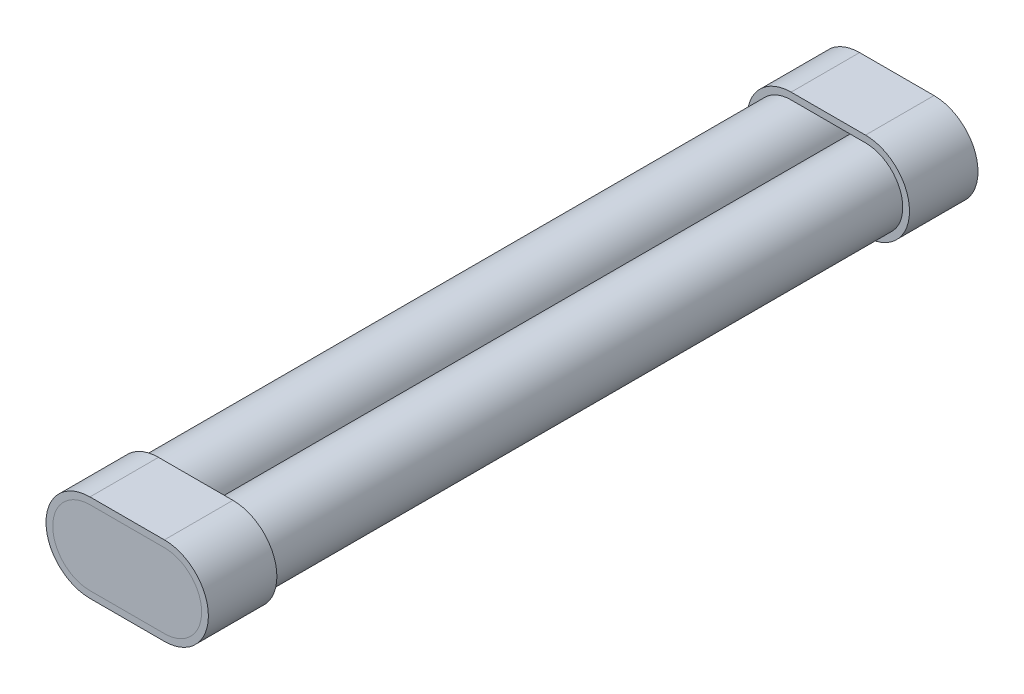
ISO-10303-21;
HEADER;
FILE_DESCRIPTION(('STEP AP214'),'2;1');
FILE_NAME('part.step','',(''),(''),'','','');
FILE_SCHEMA(('AUTOMOTIVE_DESIGN { 1 0 10303 214 1 1 1 1 }'));
ENDSEC;
DATA;
#1=APPLICATION_CONTEXT('core data for automotive mechanical design processes');
#2=APPLICATION_PROTOCOL_DEFINITION('international standard','automotive_design',2000,#1);
#3=PRODUCT_CONTEXT('',#1,'mechanical');
#4=PRODUCT('Part','Part','',(#3));
#5=PRODUCT_RELATED_PRODUCT_CATEGORY('part','',(#4));
#6=PRODUCT_DEFINITION_FORMATION('','',#4);
#7=PRODUCT_DEFINITION_CONTEXT('part definition',#1,'design');
#8=PRODUCT_DEFINITION('design','',#6,#7);
#9=PRODUCT_DEFINITION_SHAPE('','',#8);
#10=(LENGTH_UNIT() NAMED_UNIT(*) SI_UNIT(.MILLI.,.METRE.));
#11=(NAMED_UNIT(*) PLANE_ANGLE_UNIT() SI_UNIT($,.RADIAN.));
#12=(NAMED_UNIT(*) SI_UNIT($,.STERADIAN.) SOLID_ANGLE_UNIT());
#13=UNCERTAINTY_MEASURE_WITH_UNIT(LENGTH_MEASURE(1.E-05),#10,'distance_accuracy_value','');
#14=(GEOMETRIC_REPRESENTATION_CONTEXT(3) GLOBAL_UNCERTAINTY_ASSIGNED_CONTEXT((#13)) GLOBAL_UNIT_ASSIGNED_CONTEXT((#10,
#11,#12)) REPRESENTATION_CONTEXT('',''));
#15=CARTESIAN_POINT('',(0.,0.,0.));
#16=DIRECTION('',(0.,0.,1.));
#17=DIRECTION('',(1.,0.,0.));
#18=AXIS2_PLACEMENT_3D('',#15,#16,#17);
#19=CARTESIAN_POINT('',(0.,-11.,-225.5));
#20=DIRECTION('',(0.,1.,0.));
#21=DIRECTION('',(-1.,0.,0.));
#22=AXIS2_PLACEMENT_3D('',#19,#20,#21);
#23=PLANE('',#22);
#24=DIRECTION('',(-1.,0.,0.));
#25=VECTOR('',#24,1.);
#26=CARTESIAN_POINT('',(0.,-11.,-223.5));
#27=LINE('',#26,#25);
#28=CARTESIAN_POINT('',(11.,-11.,-223.5));
#29=VERTEX_POINT('',#28);
#30=CARTESIAN_POINT('',(-11.,-11.,-223.5));
#31=VERTEX_POINT('',#30);
#32=EDGE_CURVE('E126',#29,#31,#27,.T.);
#33=ORIENTED_EDGE('',*,*,#32,.T.);
#34=DIRECTION('',(0.,0.,1.));
#35=VECTOR('',#34,1.);
#36=CARTESIAN_POINT('',(-11.,-11.,-225.5));
#37=LINE('',#36,#35);
#38=CARTESIAN_POINT('',(-11.,-11.,-225.5));
#39=VERTEX_POINT('',#38);
#40=EDGE_CURVE('E13',#39,#31,#37,.T.);
#41=ORIENTED_EDGE('',*,*,#40,.F.);
#42=DIRECTION('',(-1.,0.,0.));
#43=VECTOR('',#42,1.);
#44=CARTESIAN_POINT('',(0.,-11.,-225.5));
#45=LINE('',#44,#43);
#46=CARTESIAN_POINT('',(11.,-11.,-225.5));
#47=VERTEX_POINT('',#46);
#48=EDGE_CURVE('E111',#47,#39,#45,.T.);
#49=ORIENTED_EDGE('',*,*,#48,.F.);
#50=DIRECTION('',(0.,0.,1.));
#51=VECTOR('',#50,1.);
#52=CARTESIAN_POINT('',(11.,-11.,-225.5));
#53=LINE('',#52,#51);
#54=EDGE_CURVE('E122',#47,#29,#53,.T.);
#55=ORIENTED_EDGE('',*,*,#54,.T.);
#56=EDGE_LOOP('',(#33,#41,#49,#55));
#57=FACE_BOUND('',#56,.T.);
#58=ADVANCED_FACE('F64',(#57),#23,.F.);
#59=CARTESIAN_POINT('',(-11.,0.,-225.5));
#60=DIRECTION('',(0.,0.,1.));
#61=DIRECTION('',(1.,0.,0.));
#62=AXIS2_PLACEMENT_3D('',#59,#60,#61);
#63=CYLINDRICAL_SURFACE('',#62,11.);
#64=CARTESIAN_POINT('',(-11.,0.,-223.5));
#65=DIRECTION('',(0.,0.,-1.));
#66=DIRECTION('',(-1.,0.,0.));
#67=AXIS2_PLACEMENT_3D('',#64,#65,#66);
#68=CIRCLE('',#67,11.);
#69=CARTESIAN_POINT('',(-11.,11.,-223.5));
#70=VERTEX_POINT('',#69);
#71=EDGE_CURVE('E116',#31,#70,#68,.T.);
#72=ORIENTED_EDGE('',*,*,#71,.T.);
#73=DIRECTION('',(0.,0.,1.));
#74=VECTOR('',#73,1.);
#75=CARTESIAN_POINT('',(-11.,11.,-225.5));
#76=LINE('',#75,#74);
#77=CARTESIAN_POINT('',(-11.,11.,-225.5));
#78=VERTEX_POINT('',#77);
#79=EDGE_CURVE('E72',#78,#70,#76,.T.);
#80=ORIENTED_EDGE('',*,*,#79,.F.);
#81=CARTESIAN_POINT('',(-11.,0.,-225.5));
#82=DIRECTION('',(0.,0.,-1.));
#83=DIRECTION('',(-1.,0.,0.));
#84=AXIS2_PLACEMENT_3D('',#81,#82,#83);
#85=CIRCLE('',#84,11.);
#86=EDGE_CURVE('E106',#39,#78,#85,.T.);
#87=ORIENTED_EDGE('',*,*,#86,.F.);
#88=ORIENTED_EDGE('',*,*,#40,.T.);
#89=EDGE_LOOP('',(#72,#80,#87,#88));
#90=FACE_BOUND('',#89,.T.);
#91=ADVANCED_FACE('F115',(#90),#63,.T.);
#92=CARTESIAN_POINT('',(0.,11.,-225.5));
#93=DIRECTION('',(0.,1.,0.));
#94=DIRECTION('',(-1.,0.,0.));
#95=AXIS2_PLACEMENT_3D('',#92,#93,#94);
#96=PLANE('',#95);
#97=DIRECTION('',(-1.,0.,0.));
#98=VECTOR('',#97,1.);
#99=CARTESIAN_POINT('',(0.,11.,-223.5));
#100=LINE('',#99,#98);
#101=CARTESIAN_POINT('',(11.,11.,-223.5));
#102=VERTEX_POINT('',#101);
#103=EDGE_CURVE('E130',#102,#70,#100,.T.);
#104=ORIENTED_EDGE('',*,*,#103,.F.);
#105=DIRECTION('',(0.,0.,1.));
#106=VECTOR('',#105,1.);
#107=CARTESIAN_POINT('',(11.,11.,-225.5));
#108=LINE('',#107,#106);
#109=CARTESIAN_POINT('',(11.,11.,-225.5));
#110=VERTEX_POINT('',#109);
#111=EDGE_CURVE('E96',#110,#102,#108,.T.);
#112=ORIENTED_EDGE('',*,*,#111,.F.);
#113=DIRECTION('',(-1.,0.,0.));
#114=VECTOR('',#113,1.);
#115=CARTESIAN_POINT('',(0.,11.,-225.5));
#116=LINE('',#115,#114);
#117=EDGE_CURVE('E109',#110,#78,#116,.T.);
#118=ORIENTED_EDGE('',*,*,#117,.T.);
#119=ORIENTED_EDGE('',*,*,#79,.T.);
#120=EDGE_LOOP('',(#104,#112,#118,#119));
#121=FACE_BOUND('',#120,.T.);
#122=ADVANCED_FACE('F120',(#121),#96,.T.);
#123=CARTESIAN_POINT('',(11.,0.,-225.5));
#124=DIRECTION('',(0.,0.,1.));
#125=DIRECTION('',(1.,0.,0.));
#126=AXIS2_PLACEMENT_3D('',#123,#124,#125);
#127=CYLINDRICAL_SURFACE('',#126,11.);
#128=CARTESIAN_POINT('',(11.,0.,-223.5));
#129=DIRECTION('',(0.,0.,-1.));
#130=DIRECTION('',(-1.,0.,0.));
#131=AXIS2_PLACEMENT_3D('',#128,#129,#130);
#132=CIRCLE('',#131,11.);
#133=EDGE_CURVE('E99',#102,#29,#132,.T.);
#134=ORIENTED_EDGE('',*,*,#133,.T.);
#135=ORIENTED_EDGE('',*,*,#54,.F.);
#136=CARTESIAN_POINT('',(11.,0.,-225.5));
#137=DIRECTION('',(0.,0.,-1.));
#138=DIRECTION('',(-1.,0.,0.));
#139=AXIS2_PLACEMENT_3D('',#136,#137,#138);
#140=CIRCLE('',#139,11.);
#141=EDGE_CURVE('E80',#110,#47,#140,.T.);
#142=ORIENTED_EDGE('',*,*,#141,.F.);
#143=ORIENTED_EDGE('',*,*,#111,.T.);
#144=EDGE_LOOP('',(#134,#135,#142,#143));
#145=FACE_BOUND('',#144,.T.);
#146=ADVANCED_FACE('F143',(#145),#127,.T.);
#147=CARTESIAN_POINT('',(0.,0.,-225.5));
#148=DIRECTION('',(0.,0.,-1.));
#149=DIRECTION('',(-1.,0.,0.));
#150=AXIS2_PLACEMENT_3D('',#147,#148,#149);
#151=PLANE('',#150);
#152=ORIENTED_EDGE('',*,*,#48,.T.);
#153=ORIENTED_EDGE('',*,*,#86,.T.);
#154=ORIENTED_EDGE('',*,*,#117,.F.);
#155=ORIENTED_EDGE('',*,*,#141,.T.);
#156=EDGE_LOOP('',(#152,#153,#154,#155));
#157=FACE_BOUND('',#156,.T.);
#158=ADVANCED_FACE('F107',(#157),#151,.T.);
#159=CARTESIAN_POINT('',(0.,0.,-223.5));
#160=DIRECTION('',(0.,0.,-1.));
#161=DIRECTION('',(-1.,0.,0.));
#162=AXIS2_PLACEMENT_3D('',#159,#160,#161);
#163=PLANE('',#162);
#164=ORIENTED_EDGE('',*,*,#32,.F.);
#165=ORIENTED_EDGE('',*,*,#133,.F.);
#166=ORIENTED_EDGE('',*,*,#103,.T.);
#167=ORIENTED_EDGE('',*,*,#71,.F.);
#168=EDGE_LOOP('',(#164,#165,#166,#167));
#169=FACE_BOUND('',#168,.T.);
#170=ADVANCED_FACE('F137',(#169),#163,.F.);
#171=CLOSED_SHELL('',(#58,#91,#122,#146,#158,#170));
#172=MANIFOLD_SOLID_BREP('B2',#171);
#173=CARTESIAN_POINT('',(0.,-13.,-225.5));
#174=DIRECTION('',(0.,1.,0.));
#175=DIRECTION('',(0.,0.,1.));
#176=AXIS2_PLACEMENT_3D('',#173,#174,#175);
#177=PLANE('',#176);
#178=DIRECTION('',(0.,0.,1.));
#179=VECTOR('',#178,1.);
#180=CARTESIAN_POINT('',(11.,-13.,-225.5));
#181=LINE('',#180,#179);
#182=CARTESIAN_POINT('',(11.,-13.,-225.5));
#183=VERTEX_POINT('',#182);
#184=CARTESIAN_POINT('',(11.,-13.,-205.25));
#185=VERTEX_POINT('',#184);
#186=EDGE_CURVE('E320',#183,#185,#181,.T.);
#187=ORIENTED_EDGE('',*,*,#186,.T.);
#188=DIRECTION('',(-1.,0.,0.));
#189=VECTOR('',#188,1.);
#190=CARTESIAN_POINT('',(0.,-13.,-205.25));
#191=LINE('',#190,#189);
#192=CARTESIAN_POINT('',(-11.,-13.,-205.25));
#193=VERTEX_POINT('',#192);
#194=EDGE_CURVE('E339',#185,#193,#191,.T.);
#195=ORIENTED_EDGE('',*,*,#194,.T.);
#196=DIRECTION('',(0.,0.,1.));
#197=VECTOR('',#196,1.);
#198=CARTESIAN_POINT('',(-11.,-13.,-225.5));
#199=LINE('',#198,#197);
#200=CARTESIAN_POINT('',(-11.,-13.,-225.5));
#201=VERTEX_POINT('',#200);
#202=EDGE_CURVE('E62',#201,#193,#199,.T.);
#203=ORIENTED_EDGE('',*,*,#202,.F.);
#204=DIRECTION('',(-1.,0.,0.));
#205=VECTOR('',#204,1.);
#206=CARTESIAN_POINT('',(0.,-13.,-225.5));
#207=LINE('',#206,#205);
#208=EDGE_CURVE('E360',#183,#201,#207,.T.);
#209=ORIENTED_EDGE('',*,*,#208,.F.);
#210=EDGE_LOOP('',(#187,#195,#203,#209));
#211=FACE_BOUND('',#210,.T.);
#212=ADVANCED_FACE('F243',(#211),#177,.F.);
#213=CARTESIAN_POINT('',(-11.,0.,-225.5));
#214=DIRECTION('',(0.,0.,1.));
#215=DIRECTION('',(1.,0.,0.));
#216=AXIS2_PLACEMENT_3D('',#213,#214,#215);
#217=CYLINDRICAL_SURFACE('',#216,13.);
#218=ORIENTED_EDGE('',*,*,#202,.T.);
#219=CARTESIAN_POINT('',(-11.,0.,-205.25));
#220=DIRECTION('',(0.,0.,-1.));
#221=DIRECTION('',(-1.,0.,0.));
#222=AXIS2_PLACEMENT_3D('',#219,#220,#221);
#223=CIRCLE('',#222,13.);
#224=CARTESIAN_POINT('',(-11.,13.,-205.25));
#225=VERTEX_POINT('',#224);
#226=EDGE_CURVE('E342',#193,#225,#223,.T.);
#227=ORIENTED_EDGE('',*,*,#226,.T.);
#228=DIRECTION('',(0.,0.,1.));
#229=VECTOR('',#228,1.);
#230=CARTESIAN_POINT('',(-11.,13.,-225.5));
#231=LINE('',#230,#229);
#232=CARTESIAN_POINT('',(-11.,13.,-225.5));
#233=VERTEX_POINT('',#232);
#234=EDGE_CURVE('E252',#233,#225,#231,.T.);
#235=ORIENTED_EDGE('',*,*,#234,.F.);
#236=CARTESIAN_POINT('',(-11.,0.,-225.5));
#237=DIRECTION('',(0.,0.,-1.));
#238=DIRECTION('',(-1.,0.,0.));
#239=AXIS2_PLACEMENT_3D('',#236,#237,#238);
#240=CIRCLE('',#239,13.);
#241=EDGE_CURVE('E362',#201,#233,#240,.T.);
#242=ORIENTED_EDGE('',*,*,#241,.F.);
#243=EDGE_LOOP('',(#218,#227,#235,#242));
#244=FACE_BOUND('',#243,.T.);
#245=ADVANCED_FACE('F392',(#244),#217,.T.);
#246=CARTESIAN_POINT('',(0.,13.,-225.5));
#247=DIRECTION('',(0.,1.,0.));
#248=DIRECTION('',(0.,0.,1.));
#249=AXIS2_PLACEMENT_3D('',#246,#247,#248);
#250=PLANE('',#249);
#251=ORIENTED_EDGE('',*,*,#234,.T.);
#252=DIRECTION('',(-1.,0.,0.));
#253=VECTOR('',#252,1.);
#254=CARTESIAN_POINT('',(0.,13.,-205.25));
#255=LINE('',#254,#253);
#256=CARTESIAN_POINT('',(11.,13.,-205.25));
#257=VERTEX_POINT('',#256);
#258=EDGE_CURVE('E345',#257,#225,#255,.T.);
#259=ORIENTED_EDGE('',*,*,#258,.F.);
#260=DIRECTION('',(0.,0.,1.));
#261=VECTOR('',#260,1.);
#262=CARTESIAN_POINT('',(11.,13.,-225.5));
#263=LINE('',#262,#261);
#264=CARTESIAN_POINT('',(11.,13.,-225.5));
#265=VERTEX_POINT('',#264);
#266=EDGE_CURVE('E268',#265,#257,#263,.T.);
#267=ORIENTED_EDGE('',*,*,#266,.F.);
#268=DIRECTION('',(-1.,0.,0.));
#269=VECTOR('',#268,1.);
#270=CARTESIAN_POINT('',(0.,13.,-225.5));
#271=LINE('',#270,#269);
#272=EDGE_CURVE('E364',#265,#233,#271,.T.);
#273=ORIENTED_EDGE('',*,*,#272,.T.);
#274=EDGE_LOOP('',(#251,#259,#267,#273));
#275=FACE_BOUND('',#274,.T.);
#276=ADVANCED_FACE('F397',(#275),#250,.T.);
#277=CARTESIAN_POINT('',(11.,0.,-225.5));
#278=DIRECTION('',(0.,0.,1.));
#279=DIRECTION('',(1.,0.,0.));
#280=AXIS2_PLACEMENT_3D('',#277,#278,#279);
#281=CYLINDRICAL_SURFACE('',#280,11.);
#282=DIRECTION('',(0.,0.,1.));
#283=VECTOR('',#282,1.);
#284=CARTESIAN_POINT('',(11.,-11.,-225.5));
#285=LINE('',#284,#283);
#286=CARTESIAN_POINT('',(11.,-11.,-225.5));
#287=VERTEX_POINT('',#286);
#288=CARTESIAN_POINT('',(11.,-11.,-205.25));
#289=VERTEX_POINT('',#288);
#290=EDGE_CURVE('E324',#287,#289,#285,.T.);
#291=ORIENTED_EDGE('',*,*,#290,.T.);
#292=CARTESIAN_POINT('',(11.,0.,-205.25));
#293=DIRECTION('',(0.,0.,-1.));
#294=DIRECTION('',(-1.,0.,0.));
#295=AXIS2_PLACEMENT_3D('',#292,#293,#294);
#296=CIRCLE('',#295,11.);
#297=CARTESIAN_POINT('',(11.,11.,-205.25));
#298=VERTEX_POINT('',#297);
#299=EDGE_CURVE('E323',#298,#289,#296,.T.);
#300=ORIENTED_EDGE('',*,*,#299,.F.);
#301=DIRECTION('',(0.,0.,1.));
#302=VECTOR('',#301,1.);
#303=CARTESIAN_POINT('',(11.,11.,-225.5));
#304=LINE('',#303,#302);
#305=CARTESIAN_POINT('',(11.,11.,-225.5));
#306=VERTEX_POINT('',#305);
#307=EDGE_CURVE('E247',#306,#298,#304,.T.);
#308=ORIENTED_EDGE('',*,*,#307,.F.);
#309=CARTESIAN_POINT('',(11.,0.,-225.5));
#310=DIRECTION('',(0.,0.,-1.));
#311=DIRECTION('',(-1.,0.,0.));
#312=AXIS2_PLACEMENT_3D('',#309,#310,#311);
#313=CIRCLE('',#312,11.);
#314=EDGE_CURVE('E351',#306,#287,#313,.T.);
#315=ORIENTED_EDGE('',*,*,#314,.T.);
#316=EDGE_LOOP('',(#291,#300,#308,#315));
#317=FACE_BOUND('',#316,.T.);
#318=ADVANCED_FACE('F245',(#317),#281,.F.);
#319=CARTESIAN_POINT('',(0.,11.,-225.5));
#320=DIRECTION('',(0.,1.,0.));
#321=DIRECTION('',(-1.,0.,0.));
#322=AXIS2_PLACEMENT_3D('',#319,#320,#321);
#323=PLANE('',#322);
#324=ORIENTED_EDGE('',*,*,#307,.T.);
#325=DIRECTION('',(-1.,0.,0.));
#326=VECTOR('',#325,1.);
#327=CARTESIAN_POINT('',(0.,11.,-205.25));
#328=LINE('',#327,#326);
#329=CARTESIAN_POINT('',(-11.,11.,-205.25));
#330=VERTEX_POINT('',#329);
#331=EDGE_CURVE('E315',#298,#330,#328,.T.);
#332=ORIENTED_EDGE('',*,*,#331,.T.);
#333=DIRECTION('',(0.,0.,1.));
#334=VECTOR('',#333,1.);
#335=CARTESIAN_POINT('',(-11.,11.,-225.5));
#336=LINE('',#335,#334);
#337=CARTESIAN_POINT('',(-11.,11.,-225.5));
#338=VERTEX_POINT('',#337);
#339=EDGE_CURVE('E321',#338,#330,#336,.T.);
#340=ORIENTED_EDGE('',*,*,#339,.F.);
#341=DIRECTION('',(-1.,0.,0.));
#342=VECTOR('',#341,1.);
#343=CARTESIAN_POINT('',(0.,11.,-225.5));
#344=LINE('',#343,#342);
#345=EDGE_CURVE('E316',#306,#338,#344,.T.);
#346=ORIENTED_EDGE('',*,*,#345,.F.);
#347=EDGE_LOOP('',(#324,#332,#340,#346));
#348=FACE_BOUND('',#347,.T.);
#349=ADVANCED_FACE('F312',(#348),#323,.F.);
#350=CARTESIAN_POINT('',(-11.,0.,-225.5));
#351=DIRECTION('',(0.,0.,1.));
#352=DIRECTION('',(1.,0.,0.));
#353=AXIS2_PLACEMENT_3D('',#350,#351,#352);
#354=CYLINDRICAL_SURFACE('',#353,11.);
#355=ORIENTED_EDGE('',*,*,#339,.T.);
#356=CARTESIAN_POINT('',(-11.,0.,-205.25));
#357=DIRECTION('',(0.,0.,-1.));
#358=DIRECTION('',(-1.,0.,0.));
#359=AXIS2_PLACEMENT_3D('',#356,#357,#358);
#360=CIRCLE('',#359,11.);
#361=CARTESIAN_POINT('',(-11.,-11.,-205.25));
#362=VERTEX_POINT('',#361);
#363=EDGE_CURVE('E333',#362,#330,#360,.T.);
#364=ORIENTED_EDGE('',*,*,#363,.F.);
#365=DIRECTION('',(0.,0.,1.));
#366=VECTOR('',#365,1.);
#367=CARTESIAN_POINT('',(-11.,-11.,-225.5));
#368=LINE('',#367,#366);
#369=CARTESIAN_POINT('',(-11.,-11.,-225.5));
#370=VERTEX_POINT('',#369);
#371=EDGE_CURVE('E371',#370,#362,#368,.T.);
#372=ORIENTED_EDGE('',*,*,#371,.F.);
#373=CARTESIAN_POINT('',(-11.,0.,-225.5));
#374=DIRECTION('',(0.,0.,-1.));
#375=DIRECTION('',(-1.,0.,0.));
#376=AXIS2_PLACEMENT_3D('',#373,#374,#375);
#377=CIRCLE('',#376,11.);
#378=EDGE_CURVE('E354',#370,#338,#377,.T.);
#379=ORIENTED_EDGE('',*,*,#378,.T.);
#380=EDGE_LOOP('',(#355,#364,#372,#379));
#381=FACE_BOUND('',#380,.T.);
#382=ADVANCED_FACE('F373',(#381),#354,.F.);
#383=CARTESIAN_POINT('',(0.,-11.,-225.5));
#384=DIRECTION('',(0.,1.,0.));
#385=DIRECTION('',(-1.,0.,0.));
#386=AXIS2_PLACEMENT_3D('',#383,#384,#385);
#387=PLANE('',#386);
#388=ORIENTED_EDGE('',*,*,#371,.T.);
#389=DIRECTION('',(-1.,0.,0.));
#390=VECTOR('',#389,1.);
#391=CARTESIAN_POINT('',(0.,-11.,-205.25));
#392=LINE('',#391,#390);
#393=EDGE_CURVE('E335',#289,#362,#392,.T.);
#394=ORIENTED_EDGE('',*,*,#393,.F.);
#395=ORIENTED_EDGE('',*,*,#290,.F.);
#396=DIRECTION('',(-1.,0.,0.));
#397=VECTOR('',#396,1.);
#398=CARTESIAN_POINT('',(0.,-11.,-225.5));
#399=LINE('',#398,#397);
#400=EDGE_CURVE('E357',#287,#370,#399,.T.);
#401=ORIENTED_EDGE('',*,*,#400,.T.);
#402=EDGE_LOOP('',(#388,#394,#395,#401));
#403=FACE_BOUND('',#402,.T.);
#404=ADVANCED_FACE('F379',(#403),#387,.T.);
#405=CARTESIAN_POINT('',(11.,0.,-225.5));
#406=DIRECTION('',(0.,0.,1.));
#407=DIRECTION('',(1.,0.,0.));
#408=AXIS2_PLACEMENT_3D('',#405,#406,#407);
#409=CYLINDRICAL_SURFACE('',#408,13.);
#410=ORIENTED_EDGE('',*,*,#266,.T.);
#411=CARTESIAN_POINT('',(11.,0.,-205.25));
#412=DIRECTION('',(0.,0.,-1.));
#413=DIRECTION('',(-1.,0.,0.));
#414=AXIS2_PLACEMENT_3D('',#411,#412,#413);
#415=CIRCLE('',#414,13.);
#416=EDGE_CURVE('E348',#257,#185,#415,.T.);
#417=ORIENTED_EDGE('',*,*,#416,.T.);
#418=ORIENTED_EDGE('',*,*,#186,.F.);
#419=CARTESIAN_POINT('',(11.,0.,-225.5));
#420=DIRECTION('',(0.,0.,-1.));
#421=DIRECTION('',(-1.,0.,0.));
#422=AXIS2_PLACEMENT_3D('',#419,#420,#421);
#423=CIRCLE('',#422,13.);
#424=EDGE_CURVE('E260',#265,#183,#423,.T.);
#425=ORIENTED_EDGE('',*,*,#424,.F.);
#426=EDGE_LOOP('',(#410,#417,#418,#425));
#427=FACE_BOUND('',#426,.T.);
#428=ADVANCED_FACE('F381',(#427),#409,.T.);
#429=CARTESIAN_POINT('',(0.,0.,-225.5));
#430=DIRECTION('',(0.,0.,-1.));
#431=DIRECTION('',(-1.,0.,0.));
#432=AXIS2_PLACEMENT_3D('',#429,#430,#431);
#433=PLANE('',#432);
#434=ORIENTED_EDGE('',*,*,#314,.F.);
#435=ORIENTED_EDGE('',*,*,#345,.T.);
#436=ORIENTED_EDGE('',*,*,#378,.F.);
#437=ORIENTED_EDGE('',*,*,#400,.F.);
#438=EDGE_LOOP('',(#434,#435,#436,#437));
#439=FACE_BOUND('',#438,.T.);
#440=ORIENTED_EDGE('',*,*,#208,.T.);
#441=ORIENTED_EDGE('',*,*,#241,.T.);
#442=ORIENTED_EDGE('',*,*,#272,.F.);
#443=ORIENTED_EDGE('',*,*,#424,.T.);
#444=EDGE_LOOP('',(#440,#441,#442,#443));
#445=FACE_BOUND('',#444,.T.);
#446=ADVANCED_FACE('F377',(#439,#445),#433,.T.);
#447=CARTESIAN_POINT('',(0.,0.,-205.25));
#448=DIRECTION('',(0.,0.,-1.));
#449=DIRECTION('',(-1.,0.,0.));
#450=AXIS2_PLACEMENT_3D('',#447,#448,#449);
#451=PLANE('',#450);
#452=ORIENTED_EDGE('',*,*,#299,.T.);
#453=ORIENTED_EDGE('',*,*,#393,.T.);
#454=ORIENTED_EDGE('',*,*,#363,.T.);
#455=ORIENTED_EDGE('',*,*,#331,.F.);
#456=EDGE_LOOP('',(#452,#453,#454,#455));
#457=FACE_BOUND('',#456,.T.);
#458=ORIENTED_EDGE('',*,*,#194,.F.);
#459=ORIENTED_EDGE('',*,*,#416,.F.);
#460=ORIENTED_EDGE('',*,*,#258,.T.);
#461=ORIENTED_EDGE('',*,*,#226,.F.);
#462=EDGE_LOOP('',(#458,#459,#460,#461));
#463=FACE_BOUND('',#462,.T.);
#464=ADVANCED_FACE('F330',(#457,#463),#451,.F.);
#465=CLOSED_SHELL('',(#212,#245,#276,#318,#349,#382,#404,#428,#446,#464));
#466=MANIFOLD_SOLID_BREP('B7',#465);
#467=CARTESIAN_POINT('',(0.,-11.,2.));
#468=DIRECTION('',(0.,1.,0.));
#469=DIRECTION('',(0.,0.,1.));
#470=AXIS2_PLACEMENT_3D('',#467,#468,#469);
#471=PLANE('',#470);
#472=DIRECTION('',(1.,0.,0.));
#473=VECTOR('',#472,1.);
#474=CARTESIAN_POINT('',(0.,-11.,0.));
#475=LINE('',#474,#473);
#476=CARTESIAN_POINT('',(-11.,-11.,0.));
#477=VERTEX_POINT('',#476);
#478=CARTESIAN_POINT('',(11.,-11.,0.));
#479=VERTEX_POINT('',#478);
#480=EDGE_CURVE('E588',#477,#479,#475,.T.);
#481=ORIENTED_EDGE('',*,*,#480,.T.);
#482=DIRECTION('',(0.,0.,-1.));
#483=VECTOR('',#482,1.);
#484=CARTESIAN_POINT('',(11.,-11.,2.));
#485=LINE('',#484,#483);
#486=CARTESIAN_POINT('',(11.,-11.,2.));
#487=VERTEX_POINT('',#486);
#488=EDGE_CURVE('E241',#487,#479,#485,.T.);
#489=ORIENTED_EDGE('',*,*,#488,.F.);
#490=DIRECTION('',(1.,0.,0.));
#491=VECTOR('',#490,1.);
#492=CARTESIAN_POINT('',(0.,-11.,2.));
#493=LINE('',#492,#491);
#494=CARTESIAN_POINT('',(-11.,-11.,2.));
#495=VERTEX_POINT('',#494);
#496=EDGE_CURVE('E573',#495,#487,#493,.T.);
#497=ORIENTED_EDGE('',*,*,#496,.F.);
#498=DIRECTION('',(0.,0.,-1.));
#499=VECTOR('',#498,1.);
#500=CARTESIAN_POINT('',(-11.,-11.,2.));
#501=LINE('',#500,#499);
#502=EDGE_CURVE('E584',#495,#477,#501,.T.);
#503=ORIENTED_EDGE('',*,*,#502,.T.);
#504=EDGE_LOOP('',(#481,#489,#497,#503));
#505=FACE_BOUND('',#504,.T.);
#506=ADVANCED_FACE('F526',(#505),#471,.F.);
#507=CARTESIAN_POINT('',(11.,0.,2.));
#508=DIRECTION('',(0.,0.,-1.));
#509=DIRECTION('',(-1.,0.,0.));
#510=AXIS2_PLACEMENT_3D('',#507,#508,#509);
#511=CYLINDRICAL_SURFACE('',#510,11.);
#512=CARTESIAN_POINT('',(11.,0.,0.));
#513=DIRECTION('',(0.,0.,1.));
#514=DIRECTION('',(1.,0.,0.));
#515=AXIS2_PLACEMENT_3D('',#512,#513,#514);
#516=CIRCLE('',#515,11.);
#517=CARTESIAN_POINT('',(11.,11.,0.));
#518=VERTEX_POINT('',#517);
#519=EDGE_CURVE('E578',#479,#518,#516,.T.);
#520=ORIENTED_EDGE('',*,*,#519,.T.);
#521=DIRECTION('',(0.,0.,-1.));
#522=VECTOR('',#521,1.);
#523=CARTESIAN_POINT('',(11.,11.,2.));
#524=LINE('',#523,#522);
#525=CARTESIAN_POINT('',(11.,11.,2.));
#526=VERTEX_POINT('',#525);
#527=EDGE_CURVE('E534',#526,#518,#524,.T.);
#528=ORIENTED_EDGE('',*,*,#527,.F.);
#529=CARTESIAN_POINT('',(11.,0.,2.));
#530=DIRECTION('',(0.,0.,1.));
#531=DIRECTION('',(1.,0.,0.));
#532=AXIS2_PLACEMENT_3D('',#529,#530,#531);
#533=CIRCLE('',#532,11.);
#534=EDGE_CURVE('E568',#487,#526,#533,.T.);
#535=ORIENTED_EDGE('',*,*,#534,.F.);
#536=ORIENTED_EDGE('',*,*,#488,.T.);
#537=EDGE_LOOP('',(#520,#528,#535,#536));
#538=FACE_BOUND('',#537,.T.);
#539=ADVANCED_FACE('F577',(#538),#511,.T.);
#540=CARTESIAN_POINT('',(0.,11.,2.));
#541=DIRECTION('',(0.,1.,0.));
#542=DIRECTION('',(0.,0.,1.));
#543=AXIS2_PLACEMENT_3D('',#540,#541,#542);
#544=PLANE('',#543);
#545=DIRECTION('',(1.,0.,0.));
#546=VECTOR('',#545,1.);
#547=CARTESIAN_POINT('',(0.,11.,0.));
#548=LINE('',#547,#546);
#549=CARTESIAN_POINT('',(-11.,11.,0.));
#550=VERTEX_POINT('',#549);
#551=EDGE_CURVE('E592',#550,#518,#548,.T.);
#552=ORIENTED_EDGE('',*,*,#551,.F.);
#553=DIRECTION('',(0.,0.,-1.));
#554=VECTOR('',#553,1.);
#555=CARTESIAN_POINT('',(-11.,11.,2.));
#556=LINE('',#555,#554);
#557=CARTESIAN_POINT('',(-11.,11.,2.));
#558=VERTEX_POINT('',#557);
#559=EDGE_CURVE('E558',#558,#550,#556,.T.);
#560=ORIENTED_EDGE('',*,*,#559,.F.);
#561=DIRECTION('',(1.,0.,0.));
#562=VECTOR('',#561,1.);
#563=CARTESIAN_POINT('',(0.,11.,2.));
#564=LINE('',#563,#562);
#565=EDGE_CURVE('E571',#558,#526,#564,.T.);
#566=ORIENTED_EDGE('',*,*,#565,.T.);
#567=ORIENTED_EDGE('',*,*,#527,.T.);
#568=EDGE_LOOP('',(#552,#560,#566,#567));
#569=FACE_BOUND('',#568,.T.);
#570=ADVANCED_FACE('F582',(#569),#544,.T.);
#571=CARTESIAN_POINT('',(-11.,0.,2.));
#572=DIRECTION('',(0.,0.,-1.));
#573=DIRECTION('',(-1.,0.,0.));
#574=AXIS2_PLACEMENT_3D('',#571,#572,#573);
#575=CYLINDRICAL_SURFACE('',#574,11.);
#576=CARTESIAN_POINT('',(-11.,0.,0.));
#577=DIRECTION('',(0.,0.,1.));
#578=DIRECTION('',(1.,0.,0.));
#579=AXIS2_PLACEMENT_3D('',#576,#577,#578);
#580=CIRCLE('',#579,11.);
#581=EDGE_CURVE('E561',#550,#477,#580,.T.);
#582=ORIENTED_EDGE('',*,*,#581,.T.);
#583=ORIENTED_EDGE('',*,*,#502,.F.);
#584=CARTESIAN_POINT('',(-11.,0.,2.));
#585=DIRECTION('',(0.,0.,1.));
#586=DIRECTION('',(1.,0.,0.));
#587=AXIS2_PLACEMENT_3D('',#584,#585,#586);
#588=CIRCLE('',#587,11.);
#589=EDGE_CURVE('E542',#558,#495,#588,.T.);
#590=ORIENTED_EDGE('',*,*,#589,.F.);
#591=ORIENTED_EDGE('',*,*,#559,.T.);
#592=EDGE_LOOP('',(#582,#583,#590,#591));
#593=FACE_BOUND('',#592,.T.);
#594=ADVANCED_FACE('F605',(#593),#575,.T.);
#595=CARTESIAN_POINT('',(0.,0.,2.));
#596=DIRECTION('',(0.,0.,1.));
#597=DIRECTION('',(1.,0.,0.));
#598=AXIS2_PLACEMENT_3D('',#595,#596,#597);
#599=PLANE('',#598);
#600=ORIENTED_EDGE('',*,*,#496,.T.);
#601=ORIENTED_EDGE('',*,*,#534,.T.);
#602=ORIENTED_EDGE('',*,*,#565,.F.);
#603=ORIENTED_EDGE('',*,*,#589,.T.);
#604=EDGE_LOOP('',(#600,#601,#602,#603));
#605=FACE_BOUND('',#604,.T.);
#606=ADVANCED_FACE('F569',(#605),#599,.T.);
#607=CARTESIAN_POINT('',(0.,0.,0.));
#608=DIRECTION('',(0.,0.,1.));
#609=DIRECTION('',(1.,0.,0.));
#610=AXIS2_PLACEMENT_3D('',#607,#608,#609);
#611=PLANE('',#610);
#612=ORIENTED_EDGE('',*,*,#480,.F.);
#613=ORIENTED_EDGE('',*,*,#581,.F.);
#614=ORIENTED_EDGE('',*,*,#551,.T.);
#615=ORIENTED_EDGE('',*,*,#519,.F.);
#616=EDGE_LOOP('',(#612,#613,#614,#615));
#617=FACE_BOUND('',#616,.T.);
#618=ADVANCED_FACE('F599',(#617),#611,.F.);
#619=CLOSED_SHELL('',(#506,#539,#570,#594,#606,#618));
#620=MANIFOLD_SOLID_BREP('B56',#619);
#621=CARTESIAN_POINT('',(0.,-13.,2.));
#622=DIRECTION('',(0.,1.,0.));
#623=DIRECTION('',(0.,0.,1.));
#624=AXIS2_PLACEMENT_3D('',#621,#622,#623);
#625=PLANE('',#624);
#626=DIRECTION('',(0.,0.,-1.));
#627=VECTOR('',#626,1.);
#628=CARTESIAN_POINT('',(-11.,-13.,2.));
#629=LINE('',#628,#627);
#630=CARTESIAN_POINT('',(-11.,-13.,2.));
#631=VERTEX_POINT('',#630);
#632=CARTESIAN_POINT('',(-11.,-13.,-18.25));
#633=VERTEX_POINT('',#632);
#634=EDGE_CURVE('E777',#631,#633,#629,.T.);
#635=ORIENTED_EDGE('',*,*,#634,.T.);
#636=DIRECTION('',(1.,0.,0.));
#637=VECTOR('',#636,1.);
#638=CARTESIAN_POINT('',(0.,-13.,-18.25));
#639=LINE('',#638,#637);
#640=CARTESIAN_POINT('',(11.,-13.,-18.25));
#641=VERTEX_POINT('',#640);
#642=EDGE_CURVE('E797',#633,#641,#639,.T.);
#643=ORIENTED_EDGE('',*,*,#642,.T.);
#644=DIRECTION('',(0.,0.,-1.));
#645=VECTOR('',#644,1.);
#646=CARTESIAN_POINT('',(11.,-13.,2.));
#647=LINE('',#646,#645);
#648=CARTESIAN_POINT('',(11.,-13.,2.));
#649=VERTEX_POINT('',#648);
#650=EDGE_CURVE('E524',#649,#641,#647,.T.);
#651=ORIENTED_EDGE('',*,*,#650,.F.);
#652=DIRECTION('',(1.,0.,0.));
#653=VECTOR('',#652,1.);
#654=CARTESIAN_POINT('',(0.,-13.,2.));
#655=LINE('',#654,#653);
#656=EDGE_CURVE('E817',#631,#649,#655,.T.);
#657=ORIENTED_EDGE('',*,*,#656,.F.);
#658=EDGE_LOOP('',(#635,#643,#651,#657));
#659=FACE_BOUND('',#658,.T.);
#660=ADVANCED_FACE('F700',(#659),#625,.F.);
#661=CARTESIAN_POINT('',(11.,0.,2.));
#662=DIRECTION('',(0.,0.,-1.));
#663=DIRECTION('',(-1.,0.,0.));
#664=AXIS2_PLACEMENT_3D('',#661,#662,#663);
#665=CYLINDRICAL_SURFACE('',#664,13.);
#666=ORIENTED_EDGE('',*,*,#650,.T.);
#667=CARTESIAN_POINT('',(11.,0.,-18.25));
#668=DIRECTION('',(0.,0.,1.));
#669=DIRECTION('',(1.,0.,0.));
#670=AXIS2_PLACEMENT_3D('',#667,#668,#669);
#671=CIRCLE('',#670,13.);
#672=CARTESIAN_POINT('',(11.,13.,-18.25));
#673=VERTEX_POINT('',#672);
#674=EDGE_CURVE('E800',#641,#673,#671,.T.);
#675=ORIENTED_EDGE('',*,*,#674,.T.);
#676=DIRECTION('',(0.,0.,-1.));
#677=VECTOR('',#676,1.);
#678=CARTESIAN_POINT('',(11.,13.,2.));
#679=LINE('',#678,#677);
#680=CARTESIAN_POINT('',(11.,13.,2.));
#681=VERTEX_POINT('',#680);
#682=EDGE_CURVE('E709',#681,#673,#679,.T.);
#683=ORIENTED_EDGE('',*,*,#682,.F.);
#684=CARTESIAN_POINT('',(11.,0.,2.));
#685=DIRECTION('',(0.,0.,1.));
#686=DIRECTION('',(1.,0.,0.));
#687=AXIS2_PLACEMENT_3D('',#684,#685,#686);
#688=CIRCLE('',#687,13.);
#689=EDGE_CURVE('E819',#649,#681,#688,.T.);
#690=ORIENTED_EDGE('',*,*,#689,.F.);
#691=EDGE_LOOP('',(#666,#675,#683,#690));
#692=FACE_BOUND('',#691,.T.);
#693=ADVANCED_FACE('F849',(#692),#665,.T.);
#694=CARTESIAN_POINT('',(0.,13.,2.));
#695=DIRECTION('',(0.,1.,0.));
#696=DIRECTION('',(0.,0.,1.));
#697=AXIS2_PLACEMENT_3D('',#694,#695,#696);
#698=PLANE('',#697);
#699=ORIENTED_EDGE('',*,*,#682,.T.);
#700=DIRECTION('',(1.,0.,0.));
#701=VECTOR('',#700,1.);
#702=CARTESIAN_POINT('',(0.,13.,-18.25));
#703=LINE('',#702,#701);
#704=CARTESIAN_POINT('',(-11.,13.,-18.25));
#705=VERTEX_POINT('',#704);
#706=EDGE_CURVE('E803',#705,#673,#703,.T.);
#707=ORIENTED_EDGE('',*,*,#706,.F.);
#708=DIRECTION('',(0.,0.,-1.));
#709=VECTOR('',#708,1.);
#710=CARTESIAN_POINT('',(-11.,13.,2.));
#711=LINE('',#710,#709);
#712=CARTESIAN_POINT('',(-11.,13.,2.));
#713=VERTEX_POINT('',#712);
#714=EDGE_CURVE('E725',#713,#705,#711,.T.);
#715=ORIENTED_EDGE('',*,*,#714,.F.);
#716=DIRECTION('',(1.,0.,0.));
#717=VECTOR('',#716,1.);
#718=CARTESIAN_POINT('',(0.,13.,2.));
#719=LINE('',#718,#717);
#720=EDGE_CURVE('E821',#713,#681,#719,.T.);
#721=ORIENTED_EDGE('',*,*,#720,.T.);
#722=EDGE_LOOP('',(#699,#707,#715,#721));
#723=FACE_BOUND('',#722,.T.);
#724=ADVANCED_FACE('F854',(#723),#698,.T.);
#725=CARTESIAN_POINT('',(11.,0.,2.));
#726=DIRECTION('',(0.,0.,-1.));
#727=DIRECTION('',(-1.,0.,0.));
#728=AXIS2_PLACEMENT_3D('',#725,#726,#727);
#729=CYLINDRICAL_SURFACE('',#728,11.);
#730=DIRECTION('',(0.,0.,-1.));
#731=VECTOR('',#730,1.);
#732=CARTESIAN_POINT('',(11.,11.,2.));
#733=LINE('',#732,#731);
#734=CARTESIAN_POINT('',(11.,11.,2.));
#735=VERTEX_POINT('',#734);
#736=CARTESIAN_POINT('',(11.,11.,-18.25));
#737=VERTEX_POINT('',#736);
#738=EDGE_CURVE('E791',#735,#737,#733,.T.);
#739=ORIENTED_EDGE('',*,*,#738,.T.);
#740=CARTESIAN_POINT('',(11.,0.,-18.25));
#741=DIRECTION('',(0.,0.,1.));
#742=DIRECTION('',(1.,0.,0.));
#743=AXIS2_PLACEMENT_3D('',#740,#741,#742);
#744=CIRCLE('',#743,11.);
#745=CARTESIAN_POINT('',(11.,-11.,-18.25));
#746=VERTEX_POINT('',#745);
#747=EDGE_CURVE('E785',#746,#737,#744,.T.);
#748=ORIENTED_EDGE('',*,*,#747,.F.);
#749=DIRECTION('',(0.,0.,-1.));
#750=VECTOR('',#749,1.);
#751=CARTESIAN_POINT('',(11.,-11.,2.));
#752=LINE('',#751,#750);
#753=CARTESIAN_POINT('',(11.,-11.,2.));
#754=VERTEX_POINT('',#753);
#755=EDGE_CURVE('E704',#754,#746,#752,.T.);
#756=ORIENTED_EDGE('',*,*,#755,.F.);
#757=CARTESIAN_POINT('',(11.,0.,2.));
#758=DIRECTION('',(0.,0.,1.));
#759=DIRECTION('',(1.,0.,0.));
#760=AXIS2_PLACEMENT_3D('',#757,#758,#759);
#761=CIRCLE('',#760,11.);
#762=EDGE_CURVE('E809',#754,#735,#761,.T.);
#763=ORIENTED_EDGE('',*,*,#762,.T.);
#764=EDGE_LOOP('',(#739,#748,#756,#763));
#765=FACE_BOUND('',#764,.T.);
#766=ADVANCED_FACE('F702',(#765),#729,.F.);
#767=CARTESIAN_POINT('',(0.,-11.,2.));
#768=DIRECTION('',(0.,1.,0.));
#769=DIRECTION('',(0.,0.,1.));
#770=AXIS2_PLACEMENT_3D('',#767,#768,#769);
#771=PLANE('',#770);
#772=ORIENTED_EDGE('',*,*,#755,.T.);
#773=DIRECTION('',(1.,0.,0.));
#774=VECTOR('',#773,1.);
#775=CARTESIAN_POINT('',(0.,-11.,-18.25));
#776=LINE('',#775,#774);
#777=CARTESIAN_POINT('',(-11.,-11.,-18.25));
#778=VERTEX_POINT('',#777);
#779=EDGE_CURVE('E770',#778,#746,#776,.T.);
#780=ORIENTED_EDGE('',*,*,#779,.F.);
#781=DIRECTION('',(0.,0.,-1.));
#782=VECTOR('',#781,1.);
#783=CARTESIAN_POINT('',(-11.,-11.,2.));
#784=LINE('',#783,#782);
#785=CARTESIAN_POINT('',(-11.,-11.,2.));
#786=VERTEX_POINT('',#785);
#787=EDGE_CURVE('E778',#786,#778,#784,.T.);
#788=ORIENTED_EDGE('',*,*,#787,.F.);
#789=DIRECTION('',(1.,0.,0.));
#790=VECTOR('',#789,1.);
#791=CARTESIAN_POINT('',(0.,-11.,2.));
#792=LINE('',#791,#790);
#793=EDGE_CURVE('E772',#786,#754,#792,.T.);
#794=ORIENTED_EDGE('',*,*,#793,.T.);
#795=EDGE_LOOP('',(#772,#780,#788,#794));
#796=FACE_BOUND('',#795,.T.);
#797=ADVANCED_FACE('F769',(#796),#771,.T.);
#798=CARTESIAN_POINT('',(-11.,0.,2.));
#799=DIRECTION('',(0.,0.,-1.));
#800=DIRECTION('',(-1.,0.,0.));
#801=AXIS2_PLACEMENT_3D('',#798,#799,#800);
#802=CYLINDRICAL_SURFACE('',#801,11.);
#803=ORIENTED_EDGE('',*,*,#787,.T.);
#804=CARTESIAN_POINT('',(-11.,0.,-18.25));
#805=DIRECTION('',(0.,0.,1.));
#806=DIRECTION('',(1.,0.,0.));
#807=AXIS2_PLACEMENT_3D('',#804,#805,#806);
#808=CIRCLE('',#807,11.);
#809=CARTESIAN_POINT('',(-11.,11.,-18.25));
#810=VERTEX_POINT('',#809);
#811=EDGE_CURVE('E788',#810,#778,#808,.T.);
#812=ORIENTED_EDGE('',*,*,#811,.F.);
#813=DIRECTION('',(0.,0.,-1.));
#814=VECTOR('',#813,1.);
#815=CARTESIAN_POINT('',(-11.,11.,2.));
#816=LINE('',#815,#814);
#817=CARTESIAN_POINT('',(-11.,11.,2.));
#818=VERTEX_POINT('',#817);
#819=EDGE_CURVE('E828',#818,#810,#816,.T.);
#820=ORIENTED_EDGE('',*,*,#819,.F.);
#821=CARTESIAN_POINT('',(-11.,0.,2.));
#822=DIRECTION('',(0.,0.,1.));
#823=DIRECTION('',(1.,0.,0.));
#824=AXIS2_PLACEMENT_3D('',#821,#822,#823);
#825=CIRCLE('',#824,11.);
#826=EDGE_CURVE('E812',#818,#786,#825,.T.);
#827=ORIENTED_EDGE('',*,*,#826,.T.);
#828=EDGE_LOOP('',(#803,#812,#820,#827));
#829=FACE_BOUND('',#828,.T.);
#830=ADVANCED_FACE('F830',(#829),#802,.F.);
#831=CARTESIAN_POINT('',(0.,11.,2.));
#832=DIRECTION('',(0.,1.,0.));
#833=DIRECTION('',(0.,0.,1.));
#834=AXIS2_PLACEMENT_3D('',#831,#832,#833);
#835=PLANE('',#834);
#836=ORIENTED_EDGE('',*,*,#819,.T.);
#837=DIRECTION('',(1.,0.,0.));
#838=VECTOR('',#837,1.);
#839=CARTESIAN_POINT('',(0.,11.,-18.25));
#840=LINE('',#839,#838);
#841=EDGE_CURVE('E795',#810,#737,#840,.T.);
#842=ORIENTED_EDGE('',*,*,#841,.T.);
#843=ORIENTED_EDGE('',*,*,#738,.F.);
#844=DIRECTION('',(1.,0.,0.));
#845=VECTOR('',#844,1.);
#846=CARTESIAN_POINT('',(0.,11.,2.));
#847=LINE('',#846,#845);
#848=EDGE_CURVE('E815',#818,#735,#847,.T.);
#849=ORIENTED_EDGE('',*,*,#848,.F.);
#850=EDGE_LOOP('',(#836,#842,#843,#849));
#851=FACE_BOUND('',#850,.T.);
#852=ADVANCED_FACE('F836',(#851),#835,.F.);
#853=CARTESIAN_POINT('',(-11.,0.,2.));
#854=DIRECTION('',(0.,0.,-1.));
#855=DIRECTION('',(-1.,0.,0.));
#856=AXIS2_PLACEMENT_3D('',#853,#854,#855);
#857=CYLINDRICAL_SURFACE('',#856,13.);
#858=ORIENTED_EDGE('',*,*,#714,.T.);
#859=CARTESIAN_POINT('',(-11.,0.,-18.25));
#860=DIRECTION('',(0.,0.,1.));
#861=DIRECTION('',(1.,0.,0.));
#862=AXIS2_PLACEMENT_3D('',#859,#860,#861);
#863=CIRCLE('',#862,13.);
#864=EDGE_CURVE('E806',#705,#633,#863,.T.);
#865=ORIENTED_EDGE('',*,*,#864,.T.);
#866=ORIENTED_EDGE('',*,*,#634,.F.);
#867=CARTESIAN_POINT('',(-11.,0.,2.));
#868=DIRECTION('',(0.,0.,1.));
#869=DIRECTION('',(1.,0.,0.));
#870=AXIS2_PLACEMENT_3D('',#867,#868,#869);
#871=CIRCLE('',#870,13.);
#872=EDGE_CURVE('E717',#713,#631,#871,.T.);
#873=ORIENTED_EDGE('',*,*,#872,.F.);
#874=EDGE_LOOP('',(#858,#865,#866,#873));
#875=FACE_BOUND('',#874,.T.);
#876=ADVANCED_FACE('F838',(#875),#857,.T.);
#877=CARTESIAN_POINT('',(0.,0.,2.));
#878=DIRECTION('',(0.,0.,1.));
#879=DIRECTION('',(1.,0.,0.));
#880=AXIS2_PLACEMENT_3D('',#877,#878,#879);
#881=PLANE('',#880);
#882=ORIENTED_EDGE('',*,*,#762,.F.);
#883=ORIENTED_EDGE('',*,*,#793,.F.);
#884=ORIENTED_EDGE('',*,*,#826,.F.);
#885=ORIENTED_EDGE('',*,*,#848,.T.);
#886=EDGE_LOOP('',(#882,#883,#884,#885));
#887=FACE_BOUND('',#886,.T.);
#888=ORIENTED_EDGE('',*,*,#656,.T.);
#889=ORIENTED_EDGE('',*,*,#689,.T.);
#890=ORIENTED_EDGE('',*,*,#720,.F.);
#891=ORIENTED_EDGE('',*,*,#872,.T.);
#892=EDGE_LOOP('',(#888,#889,#890,#891));
#893=FACE_BOUND('',#892,.T.);
#894=ADVANCED_FACE('F833',(#887,#893),#881,.T.);
#895=CARTESIAN_POINT('',(0.,0.,-18.25));
#896=DIRECTION('',(0.,0.,1.));
#897=DIRECTION('',(1.,0.,0.));
#898=AXIS2_PLACEMENT_3D('',#895,#896,#897);
#899=PLANE('',#898);
#900=ORIENTED_EDGE('',*,*,#747,.T.);
#901=ORIENTED_EDGE('',*,*,#841,.F.);
#902=ORIENTED_EDGE('',*,*,#811,.T.);
#903=ORIENTED_EDGE('',*,*,#779,.T.);
#904=EDGE_LOOP('',(#900,#901,#902,#903));
#905=FACE_BOUND('',#904,.T.);
#906=ORIENTED_EDGE('',*,*,#642,.F.);
#907=ORIENTED_EDGE('',*,*,#864,.F.);
#908=ORIENTED_EDGE('',*,*,#706,.T.);
#909=ORIENTED_EDGE('',*,*,#674,.F.);
#910=EDGE_LOOP('',(#906,#907,#908,#909));
#911=FACE_BOUND('',#910,.T.);
#912=ADVANCED_FACE('F782',(#905,#911),#899,.F.);
#913=CLOSED_SHELL('',(#660,#693,#724,#766,#797,#830,#852,#876,#894,#912));
#914=MANIFOLD_SOLID_BREP('B235',#913);
#915=CARTESIAN_POINT('',(11.,0.,-223.5));
#916=DIRECTION('',(0.,0.,1.));
#917=DIRECTION('',(1.,0.,0.));
#918=AXIS2_PLACEMENT_3D('',#915,#916,#917);
#919=CYLINDRICAL_SURFACE('',#918,11.);
#920=CARTESIAN_POINT('',(11.,0.,-223.5));
#921=DIRECTION('',(0.,0.,1.));
#922=DIRECTION('',(1.,0.,0.));
#923=AXIS2_PLACEMENT_3D('',#920,#921,#922);
#924=CIRCLE('',#923,11.);
#925=CARTESIAN_POINT('',(22.,0.,-223.5));
#926=VERTEX_POINT('',#925);
#927=EDGE_CURVE('E699',#926,#926,#924,.T.);
#928=ORIENTED_EDGE('',*,*,#927,.T.);
#929=EDGE_LOOP('',(#928));
#930=FACE_BOUND('',#929,.T.);
#931=CARTESIAN_POINT('',(11.,0.,0.));
#932=DIRECTION('',(0.,0.,1.));
#933=DIRECTION('',(1.,0.,0.));
#934=AXIS2_PLACEMENT_3D('',#931,#932,#933);
#935=CIRCLE('',#934,11.);
#936=CARTESIAN_POINT('',(22.,0.,0.));
#937=VERTEX_POINT('',#936);
#938=EDGE_CURVE('E980',#937,#937,#935,.T.);
#939=ORIENTED_EDGE('',*,*,#938,.F.);
#940=EDGE_LOOP('',(#939));
#941=FACE_BOUND('',#940,.T.);
#942=ADVANCED_FACE('F977',(#930,#941),#919,.T.);
#943=CARTESIAN_POINT('',(0.,0.,-223.5));
#944=DIRECTION('',(0.,0.,1.));
#945=DIRECTION('',(1.,0.,0.));
#946=AXIS2_PLACEMENT_3D('',#943,#944,#945);
#947=PLANE('',#946);
#948=ORIENTED_EDGE('',*,*,#927,.F.);
#949=EDGE_LOOP('',(#948));
#950=FACE_BOUND('',#949,.T.);
#951=ADVANCED_FACE('F992',(#950),#947,.F.);
#952=CARTESIAN_POINT('',(0.,0.,0.));
#953=DIRECTION('',(0.,0.,1.));
#954=DIRECTION('',(1.,0.,0.));
#955=AXIS2_PLACEMENT_3D('',#952,#953,#954);
#956=PLANE('',#955);
#957=ORIENTED_EDGE('',*,*,#938,.T.);
#958=EDGE_LOOP('',(#957));
#959=FACE_BOUND('',#958,.T.);
#960=ADVANCED_FACE('F989',(#959),#956,.T.);
#961=CLOSED_SHELL('',(#942,#951,#960));
#962=MANIFOLD_SOLID_BREP('B518',#961);
#963=CARTESIAN_POINT('',(-11.,0.,-223.5));
#964=DIRECTION('',(0.,0.,1.));
#965=DIRECTION('',(1.,0.,0.));
#966=AXIS2_PLACEMENT_3D('',#963,#964,#965);
#967=CYLINDRICAL_SURFACE('',#966,11.);
#968=CARTESIAN_POINT('',(-11.,0.,-223.5));
#969=DIRECTION('',(0.,0.,1.));
#970=DIRECTION('',(1.,0.,0.));
#971=AXIS2_PLACEMENT_3D('',#968,#969,#970);
#972=CIRCLE('',#971,11.);
#973=CARTESIAN_POINT('',(0.,0.,-223.5));
#974=VERTEX_POINT('',#973);
#975=EDGE_CURVE('E976',#974,#974,#972,.T.);
#976=ORIENTED_EDGE('',*,*,#975,.T.);
#977=EDGE_LOOP('',(#976));
#978=FACE_BOUND('',#977,.T.);
#979=CARTESIAN_POINT('',(-11.,0.,0.));
#980=DIRECTION('',(0.,0.,1.));
#981=DIRECTION('',(1.,0.,0.));
#982=AXIS2_PLACEMENT_3D('',#979,#980,#981);
#983=CIRCLE('',#982,11.);
#984=CARTESIAN_POINT('',(0.,0.,0.));
#985=VERTEX_POINT('',#984);
#986=EDGE_CURVE('E1039',#985,#985,#983,.T.);
#987=ORIENTED_EDGE('',*,*,#986,.F.);
#988=EDGE_LOOP('',(#987));
#989=FACE_BOUND('',#988,.T.);
#990=ADVANCED_FACE('F1036',(#978,#989),#967,.T.);
#991=CARTESIAN_POINT('',(0.,0.,-223.5));
#992=DIRECTION('',(0.,0.,1.));
#993=DIRECTION('',(1.,0.,0.));
#994=AXIS2_PLACEMENT_3D('',#991,#992,#993);
#995=PLANE('',#994);
#996=ORIENTED_EDGE('',*,*,#975,.F.);
#997=EDGE_LOOP('',(#996));
#998=FACE_BOUND('',#997,.T.);
#999=ADVANCED_FACE('F1051',(#998),#995,.F.);
#1000=CARTESIAN_POINT('',(0.,0.,0.));
#1001=DIRECTION('',(0.,0.,1.));
#1002=DIRECTION('',(1.,0.,0.));
#1003=AXIS2_PLACEMENT_3D('',#1000,#1001,#1002);
#1004=PLANE('',#1003);
#1005=ORIENTED_EDGE('',*,*,#986,.T.);
#1006=EDGE_LOOP('',(#1005));
#1007=FACE_BOUND('',#1006,.T.);
#1008=ADVANCED_FACE('F1048',(#1007),#1004,.T.);
#1009=CLOSED_SHELL('',(#990,#999,#1008));
#1010=MANIFOLD_SOLID_BREP('B694',#1009);
#1011=ADVANCED_BREP_SHAPE_REPRESENTATION('',(#18,#172,#466,#620,#914,#962,#1010),#14);
#1012=SHAPE_DEFINITION_REPRESENTATION(#9,#1011);
ENDSEC;
END-ISO-10303-21;
